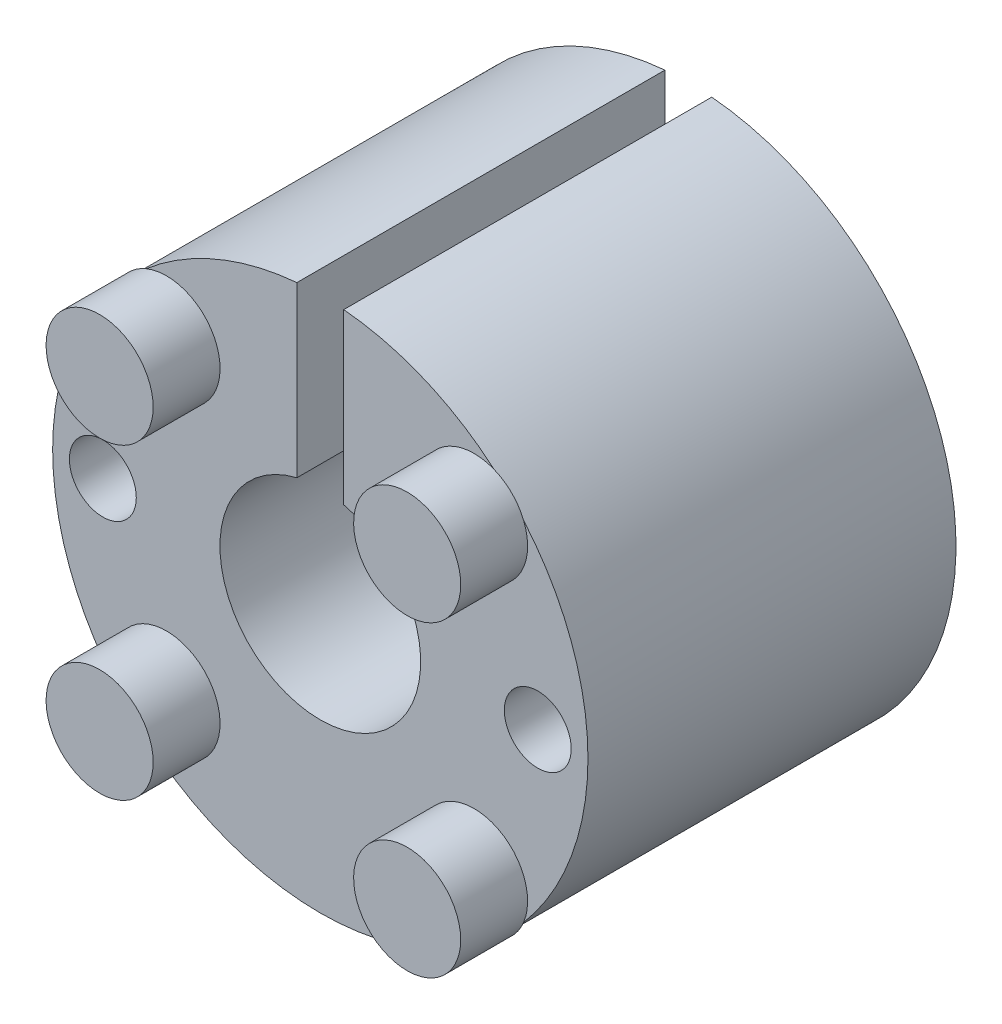
ISO-10303-21;
HEADER;
FILE_DESCRIPTION(('STEP AP214'),'2;1');
FILE_NAME('part.step','',(''),(''),'','','');
FILE_SCHEMA(('AUTOMOTIVE_DESIGN { 1 0 10303 214 1 1 1 1 }'));
ENDSEC;
DATA;
#1=APPLICATION_CONTEXT('core data for automotive mechanical design processes');
#2=APPLICATION_PROTOCOL_DEFINITION('international standard','automotive_design',2000,#1);
#3=PRODUCT_CONTEXT('',#1,'mechanical');
#4=PRODUCT('Part','Part','',(#3));
#5=PRODUCT_RELATED_PRODUCT_CATEGORY('part','',(#4));
#6=PRODUCT_DEFINITION_FORMATION('','',#4);
#7=PRODUCT_DEFINITION_CONTEXT('part definition',#1,'design');
#8=PRODUCT_DEFINITION('design','',#6,#7);
#9=PRODUCT_DEFINITION_SHAPE('','',#8);
#10=(LENGTH_UNIT() NAMED_UNIT(*) SI_UNIT(.MILLI.,.METRE.));
#11=(NAMED_UNIT(*) PLANE_ANGLE_UNIT() SI_UNIT($,.RADIAN.));
#12=(NAMED_UNIT(*) SI_UNIT($,.STERADIAN.) SOLID_ANGLE_UNIT());
#13=UNCERTAINTY_MEASURE_WITH_UNIT(LENGTH_MEASURE(1.E-05),#10,'distance_accuracy_value','');
#14=(GEOMETRIC_REPRESENTATION_CONTEXT(3) GLOBAL_UNCERTAINTY_ASSIGNED_CONTEXT((#13)) GLOBAL_UNIT_ASSIGNED_CONTEXT((#10,
#11,#12)) REPRESENTATION_CONTEXT('',''));
#15=CARTESIAN_POINT('',(0.,0.,0.));
#16=DIRECTION('',(0.,0.,1.));
#17=DIRECTION('',(1.,0.,0.));
#18=AXIS2_PLACEMENT_3D('',#15,#16,#17);
#19=CARTESIAN_POINT('',(0.,0.,11.));
#20=DIRECTION('',(0.,0.,1.));
#21=DIRECTION('',(1.,0.,0.));
#22=AXIS2_PLACEMENT_3D('',#19,#20,#21);
#23=PLANE('',#22);
#24=CARTESIAN_POINT('',(0.,0.,11.));
#25=DIRECTION('',(0.,0.,1.));
#26=DIRECTION('',(1.,0.,0.));
#27=AXIS2_PLACEMENT_3D('',#24,#25,#26);
#28=CIRCLE('',#27,8.);
#29=CARTESIAN_POINT('',(-0.700000000000001,7.96931615635871,11.));
#30=VERTEX_POINT('',#29);
#31=CARTESIAN_POINT('',(-5.20354670115188,6.07643824365322,11.));
#32=VERTEX_POINT('',#31);
#33=EDGE_CURVE('E111',#30,#32,#28,.T.);
#34=ORIENTED_EDGE('',*,*,#33,.T.);
#35=CARTESIAN_POINT('',(-4.59619407771257,4.59619407771255,11.));
#36=DIRECTION('',(0.,0.,1.));
#37=DIRECTION('',(1.,0.,0.));
#38=AXIS2_PLACEMENT_3D('',#35,#36,#37);
#39=CIRCLE('',#38,1.6);
#40=CARTESIAN_POINT('',(-6.07643824365324,5.20354670115186,11.));
#41=VERTEX_POINT('',#40);
#42=EDGE_CURVE('E113',#41,#32,#39,.T.);
#43=ORIENTED_EDGE('',*,*,#42,.F.);
#44=CARTESIAN_POINT('',(-6.07643824365322,-5.20354670115188,11.));
#45=VERTEX_POINT('',#44);
#46=EDGE_CURVE('E65',#41,#45,#28,.T.);
#47=ORIENTED_EDGE('',*,*,#46,.T.);
#48=CARTESIAN_POINT('',(-4.59619407771255,-4.59619407771257,11.));
#49=DIRECTION('',(0.,0.,1.));
#50=DIRECTION('',(1.,0.,0.));
#51=AXIS2_PLACEMENT_3D('',#48,#49,#50);
#52=CIRCLE('',#51,1.6);
#53=CARTESIAN_POINT('',(-5.20354670115186,-6.07643824365324,11.));
#54=VERTEX_POINT('',#53);
#55=EDGE_CURVE('E127',#54,#45,#52,.T.);
#56=ORIENTED_EDGE('',*,*,#55,.F.);
#57=CARTESIAN_POINT('',(5.20354670115188,-6.07643824365321,11.));
#58=VERTEX_POINT('',#57);
#59=EDGE_CURVE('E123',#54,#58,#28,.T.);
#60=ORIENTED_EDGE('',*,*,#59,.T.);
#61=CARTESIAN_POINT('',(4.59619407771257,-4.59619407771255,11.));
#62=DIRECTION('',(0.,0.,1.));
#63=DIRECTION('',(1.,0.,0.));
#64=AXIS2_PLACEMENT_3D('',#61,#62,#63);
#65=CIRCLE('',#64,1.6);
#66=CARTESIAN_POINT('',(6.07643824365324,-5.20354670115186,11.));
#67=VERTEX_POINT('',#66);
#68=EDGE_CURVE('E133',#67,#58,#65,.T.);
#69=ORIENTED_EDGE('',*,*,#68,.F.);
#70=CARTESIAN_POINT('',(6.07643824365321,5.2035467011519,11.));
#71=VERTEX_POINT('',#70);
#72=EDGE_CURVE('E208',#67,#71,#28,.T.);
#73=ORIENTED_EDGE('',*,*,#72,.T.);
#74=CARTESIAN_POINT('',(4.59619407771255,4.59619407771257,11.));
#75=DIRECTION('',(0.,0.,1.));
#76=DIRECTION('',(1.,0.,0.));
#77=AXIS2_PLACEMENT_3D('',#74,#75,#76);
#78=CIRCLE('',#77,1.6);
#79=CARTESIAN_POINT('',(5.20354670115188,6.07643824365322,11.));
#80=VERTEX_POINT('',#79);
#81=EDGE_CURVE('E11',#80,#71,#78,.T.);
#82=ORIENTED_EDGE('',*,*,#81,.F.);
#83=CARTESIAN_POINT('',(0.699999999999999,7.96931615635871,11.));
#84=VERTEX_POINT('',#83);
#85=EDGE_CURVE('E186',#80,#84,#28,.T.);
#86=ORIENTED_EDGE('',*,*,#85,.T.);
#87=DIRECTION('',(0.,1.,0.));
#88=VECTOR('',#87,1.);
#89=CARTESIAN_POINT('',(0.699999999999999,9.54270747111453,11.));
#90=LINE('',#89,#88);
#91=CARTESIAN_POINT('',(0.7,2.91719042916296,11.));
#92=VERTEX_POINT('',#91);
#93=EDGE_CURVE('E161',#92,#84,#90,.T.);
#94=ORIENTED_EDGE('',*,*,#93,.F.);
#95=CARTESIAN_POINT('',(0.,0.,11.));
#96=DIRECTION('',(0.,0.,1.));
#97=DIRECTION('',(1.,0.,0.));
#98=AXIS2_PLACEMENT_3D('',#95,#96,#97);
#99=CIRCLE('',#98,3.);
#100=CARTESIAN_POINT('',(-0.7,2.91719042916296,11.));
#101=VERTEX_POINT('',#100);
#102=EDGE_CURVE('E177',#101,#92,#99,.T.);
#103=ORIENTED_EDGE('',*,*,#102,.F.);
#104=DIRECTION('',(0.,-1.,0.));
#105=VECTOR('',#104,1.);
#106=CARTESIAN_POINT('',(-0.700000000000001,9.54270747111453,11.));
#107=LINE('',#106,#105);
#108=EDGE_CURVE('E151',#30,#101,#107,.T.);
#109=ORIENTED_EDGE('',*,*,#108,.F.);
#110=EDGE_LOOP('',(#34,#43,#47,#56,#60,#69,#73,#82,#86,#94,#103,#109));
#111=FACE_BOUND('',#110,.T.);
#112=CARTESIAN_POINT('',(6.5,0.,11.));
#113=DIRECTION('',(0.,0.,1.));
#114=DIRECTION('',(1.,0.,0.));
#115=AXIS2_PLACEMENT_3D('',#112,#113,#114);
#116=CIRCLE('',#115,1.);
#117=CARTESIAN_POINT('',(7.5,0.,11.));
#118=VERTEX_POINT('',#117);
#119=EDGE_CURVE('E152',#118,#118,#116,.T.);
#120=ORIENTED_EDGE('',*,*,#119,.F.);
#121=EDGE_LOOP('',(#120));
#122=FACE_BOUND('',#121,.T.);
#123=CARTESIAN_POINT('',(-6.5,0.,11.));
#124=DIRECTION('',(0.,0.,1.));
#125=DIRECTION('',(1.,0.,0.));
#126=AXIS2_PLACEMENT_3D('',#123,#124,#125);
#127=CIRCLE('',#126,1.);
#128=CARTESIAN_POINT('',(-5.5,0.,11.));
#129=VERTEX_POINT('',#128);
#130=EDGE_CURVE('E145',#129,#129,#127,.T.);
#131=ORIENTED_EDGE('',*,*,#130,.F.);
#132=EDGE_LOOP('',(#131));
#133=FACE_BOUND('',#132,.T.);
#134=ADVANCED_FACE('F41',(#111,#122,#133),#23,.T.);
#135=CARTESIAN_POINT('',(0.,0.,0.));
#136=DIRECTION('',(0.,0.,1.));
#137=DIRECTION('',(1.,0.,0.));
#138=AXIS2_PLACEMENT_3D('',#135,#136,#137);
#139=PLANE('',#138);
#140=CARTESIAN_POINT('',(0.,0.,0.));
#141=DIRECTION('',(0.,0.,1.));
#142=DIRECTION('',(1.,0.,0.));
#143=AXIS2_PLACEMENT_3D('',#140,#141,#142);
#144=CIRCLE('',#143,8.);
#145=CARTESIAN_POINT('',(-0.700000000000001,7.96931615635871,0.));
#146=VERTEX_POINT('',#145);
#147=CARTESIAN_POINT('',(0.699999999999999,7.96931615635871,0.));
#148=VERTEX_POINT('',#147);
#149=EDGE_CURVE('E180',#146,#148,#144,.T.);
#150=ORIENTED_EDGE('',*,*,#149,.F.);
#151=DIRECTION('',(0.,-1.,0.));
#152=VECTOR('',#151,1.);
#153=CARTESIAN_POINT('',(-0.7,0.,0.));
#154=LINE('',#153,#152);
#155=CARTESIAN_POINT('',(-0.7,2.91719042916296,0.));
#156=VERTEX_POINT('',#155);
#157=EDGE_CURVE('E170',#146,#156,#154,.T.);
#158=ORIENTED_EDGE('',*,*,#157,.T.);
#159=CARTESIAN_POINT('',(0.,0.,0.));
#160=DIRECTION('',(0.,0.,1.));
#161=DIRECTION('',(1.,0.,0.));
#162=AXIS2_PLACEMENT_3D('',#159,#160,#161);
#163=CIRCLE('',#162,3.);
#164=CARTESIAN_POINT('',(0.7,2.91719042916296,0.));
#165=VERTEX_POINT('',#164);
#166=EDGE_CURVE('E176',#156,#165,#163,.T.);
#167=ORIENTED_EDGE('',*,*,#166,.T.);
#168=DIRECTION('',(0.,1.,0.));
#169=VECTOR('',#168,1.);
#170=CARTESIAN_POINT('',(0.7,0.,0.));
#171=LINE('',#170,#169);
#172=EDGE_CURVE('E164',#165,#148,#171,.T.);
#173=ORIENTED_EDGE('',*,*,#172,.T.);
#174=EDGE_LOOP('',(#150,#158,#167,#173));
#175=FACE_BOUND('',#174,.T.);
#176=ADVANCED_FACE('F198',(#175),#139,.F.);
#177=CARTESIAN_POINT('',(0.,0.,11.));
#178=DIRECTION('',(0.,0.,-1.));
#179=DIRECTION('',(-1.,0.,0.));
#180=AXIS2_PLACEMENT_3D('',#177,#178,#179);
#181=CYLINDRICAL_SURFACE('',#180,8.);
#182=ORIENTED_EDGE('',*,*,#33,.F.);
#183=DIRECTION('',(0.,0.,-1.));
#184=VECTOR('',#183,1.);
#185=CARTESIAN_POINT('',(-0.700000000000001,7.96931615635871,11.));
#186=LINE('',#185,#184);
#187=EDGE_CURVE('E173',#30,#146,#186,.T.);
#188=ORIENTED_EDGE('',*,*,#187,.T.);
#189=ORIENTED_EDGE('',*,*,#149,.T.);
#190=DIRECTION('',(0.,0.,-1.));
#191=VECTOR('',#190,1.);
#192=CARTESIAN_POINT('',(0.699999999999999,7.96931615635871,11.));
#193=LINE('',#192,#191);
#194=EDGE_CURVE('E167',#148,#84,#193,.F.);
#195=ORIENTED_EDGE('',*,*,#194,.T.);
#196=ORIENTED_EDGE('',*,*,#85,.F.);
#197=EDGE_CURVE('E184',#71,#80,#28,.T.);
#198=ORIENTED_EDGE('',*,*,#197,.F.);
#199=ORIENTED_EDGE('',*,*,#72,.F.);
#200=EDGE_CURVE('E204',#58,#67,#28,.T.);
#201=ORIENTED_EDGE('',*,*,#200,.F.);
#202=ORIENTED_EDGE('',*,*,#59,.F.);
#203=EDGE_CURVE('E108',#45,#54,#28,.T.);
#204=ORIENTED_EDGE('',*,*,#203,.F.);
#205=ORIENTED_EDGE('',*,*,#46,.F.);
#206=EDGE_CURVE('E58',#32,#41,#28,.T.);
#207=ORIENTED_EDGE('',*,*,#206,.F.);
#208=EDGE_LOOP('',(#182,#188,#189,#195,#196,#198,#199,#201,#202,#204,#205,#207));
#209=FACE_BOUND('',#208,.T.);
#210=ADVANCED_FACE('F43',(#209),#181,.T.);
#211=CARTESIAN_POINT('',(0.,0.,11.));
#212=DIRECTION('',(0.,0.,-1.));
#213=DIRECTION('',(-1.,0.,0.));
#214=AXIS2_PLACEMENT_3D('',#211,#212,#213);
#215=CYLINDRICAL_SURFACE('',#214,3.);
#216=DIRECTION('',(0.,0.,-1.));
#217=VECTOR('',#216,1.);
#218=CARTESIAN_POINT('',(-0.7,2.91719042916296,11.));
#219=LINE('',#218,#217);
#220=EDGE_CURVE('E45',#101,#156,#219,.T.);
#221=ORIENTED_EDGE('',*,*,#220,.F.);
#222=ORIENTED_EDGE('',*,*,#102,.T.);
#223=DIRECTION('',(0.,0.,-1.));
#224=VECTOR('',#223,1.);
#225=CARTESIAN_POINT('',(0.7,2.91719042916296,11.));
#226=LINE('',#225,#224);
#227=EDGE_CURVE('E183',#165,#92,#226,.F.);
#228=ORIENTED_EDGE('',*,*,#227,.F.);
#229=ORIENTED_EDGE('',*,*,#166,.F.);
#230=EDGE_LOOP('',(#221,#222,#228,#229));
#231=FACE_BOUND('',#230,.T.);
#232=ADVANCED_FACE('F199',(#231),#215,.F.);
#233=CARTESIAN_POINT('',(0.699999999999999,9.54270747111453,-2.5));
#234=DIRECTION('',(1.,0.,0.));
#235=DIRECTION('',(0.,1.,0.));
#236=AXIS2_PLACEMENT_3D('',#233,#234,#235);
#237=PLANE('',#236);
#238=ORIENTED_EDGE('',*,*,#172,.F.);
#239=ORIENTED_EDGE('',*,*,#227,.T.);
#240=ORIENTED_EDGE('',*,*,#93,.T.);
#241=ORIENTED_EDGE('',*,*,#194,.F.);
#242=EDGE_LOOP('',(#238,#239,#240,#241));
#243=FACE_BOUND('',#242,.T.);
#244=ADVANCED_FACE('F201',(#243),#237,.F.);
#245=CARTESIAN_POINT('',(-0.700000000000001,9.54270747111453,-2.5));
#246=DIRECTION('',(-1.,0.,0.));
#247=DIRECTION('',(0.,-1.,0.));
#248=AXIS2_PLACEMENT_3D('',#245,#246,#247);
#249=PLANE('',#248);
#250=ORIENTED_EDGE('',*,*,#108,.T.);
#251=ORIENTED_EDGE('',*,*,#220,.T.);
#252=ORIENTED_EDGE('',*,*,#157,.F.);
#253=ORIENTED_EDGE('',*,*,#187,.F.);
#254=EDGE_LOOP('',(#250,#251,#252,#253));
#255=FACE_BOUND('',#254,.T.);
#256=ADVANCED_FACE('F192',(#255),#249,.F.);
#257=CARTESIAN_POINT('',(-6.5,0.,7.5));
#258=DIRECTION('',(0.,0.,1.));
#259=DIRECTION('',(1.,0.,0.));
#260=AXIS2_PLACEMENT_3D('',#257,#258,#259);
#261=CYLINDRICAL_SURFACE('',#260,1.);
#262=CARTESIAN_POINT('',(-6.5,0.,7.5));
#263=DIRECTION('',(0.,0.,1.));
#264=DIRECTION('',(1.,0.,0.));
#265=AXIS2_PLACEMENT_3D('',#262,#263,#264);
#266=CIRCLE('',#265,1.);
#267=CARTESIAN_POINT('',(-5.5,0.,7.5));
#268=VERTEX_POINT('',#267);
#269=EDGE_CURVE('E155',#268,#268,#266,.T.);
#270=CARTESIAN_POINT('',(-5.5,0.,7.5));
#271=CARTESIAN_POINT('',(-5.5,0.,7.53645833333333));
#272=CARTESIAN_POINT('',(-5.5,0.,7.57291666666667));
#273=CARTESIAN_POINT('',(-5.5,0.,7.64583333333333));
#274=CARTESIAN_POINT('',(-5.5,0.,7.68229166666667));
#275=CARTESIAN_POINT('',(-5.5,0.,7.75520833333333));
#276=CARTESIAN_POINT('',(-5.5,0.,7.79166666666667));
#277=CARTESIAN_POINT('',(-5.5,0.,7.86458333333333));
#278=CARTESIAN_POINT('',(-5.5,0.,7.90104166666667));
#279=CARTESIAN_POINT('',(-5.5,0.,7.97395833333333));
#280=CARTESIAN_POINT('',(-5.5,0.,8.01041666666667));
#281=CARTESIAN_POINT('',(-5.5,0.,8.08333333333333));
#282=CARTESIAN_POINT('',(-5.5,0.,8.11979166666667));
#283=CARTESIAN_POINT('',(-5.5,0.,8.19270833333333));
#284=CARTESIAN_POINT('',(-5.5,0.,8.22916666666667));
#285=CARTESIAN_POINT('',(-5.5,0.,8.30208333333333));
#286=CARTESIAN_POINT('',(-5.5,0.,8.33854166666667));
#287=CARTESIAN_POINT('',(-5.5,0.,8.41145833333333));
#288=CARTESIAN_POINT('',(-5.5,0.,8.44791666666667));
#289=CARTESIAN_POINT('',(-5.5,0.,8.52083333333333));
#290=CARTESIAN_POINT('',(-5.5,0.,8.55729166666667));
#291=CARTESIAN_POINT('',(-5.5,0.,8.63020833333333));
#292=CARTESIAN_POINT('',(-5.5,0.,8.66666666666667));
#293=CARTESIAN_POINT('',(-5.5,0.,8.73958333333333));
#294=CARTESIAN_POINT('',(-5.5,0.,8.77604166666667));
#295=CARTESIAN_POINT('',(-5.5,0.,8.84895833333333));
#296=CARTESIAN_POINT('',(-5.5,0.,8.88541666666667));
#297=CARTESIAN_POINT('',(-5.5,0.,8.95833333333333));
#298=CARTESIAN_POINT('',(-5.5,0.,8.99479166666667));
#299=CARTESIAN_POINT('',(-5.5,0.,9.06770833333333));
#300=CARTESIAN_POINT('',(-5.5,0.,9.10416666666667));
#301=CARTESIAN_POINT('',(-5.5,0.,9.17708333333333));
#302=CARTESIAN_POINT('',(-5.5,0.,9.21354166666666));
#303=CARTESIAN_POINT('',(-5.5,0.,9.28645833333333));
#304=CARTESIAN_POINT('',(-5.5,0.,9.32291666666666));
#305=CARTESIAN_POINT('',(-5.5,0.,9.39583333333333));
#306=CARTESIAN_POINT('',(-5.5,0.,9.43229166666667));
#307=CARTESIAN_POINT('',(-5.5,0.,9.50520833333333));
#308=CARTESIAN_POINT('',(-5.5,0.,9.54166666666667));
#309=CARTESIAN_POINT('',(-5.5,0.,9.61458333333333));
#310=CARTESIAN_POINT('',(-5.5,0.,9.65104166666667));
#311=CARTESIAN_POINT('',(-5.5,0.,9.72395833333333));
#312=CARTESIAN_POINT('',(-5.5,0.,9.76041666666667));
#313=CARTESIAN_POINT('',(-5.5,0.,9.83333333333333));
#314=CARTESIAN_POINT('',(-5.5,0.,9.86979166666667));
#315=CARTESIAN_POINT('',(-5.5,0.,9.94270833333333));
#316=CARTESIAN_POINT('',(-5.5,0.,9.97916666666667));
#317=CARTESIAN_POINT('',(-5.5,0.,10.0520833333333));
#318=CARTESIAN_POINT('',(-5.5,0.,10.0885416666667));
#319=CARTESIAN_POINT('',(-5.5,0.,10.1614583333333));
#320=CARTESIAN_POINT('',(-5.5,0.,10.1979166666667));
#321=CARTESIAN_POINT('',(-5.5,0.,10.2708333333333));
#322=CARTESIAN_POINT('',(-5.5,0.,10.3072916666667));
#323=CARTESIAN_POINT('',(-5.5,0.,10.3802083333333));
#324=CARTESIAN_POINT('',(-5.5,0.,10.4166666666667));
#325=CARTESIAN_POINT('',(-5.5,0.,10.4895833333333));
#326=CARTESIAN_POINT('',(-5.5,0.,10.5260416666667));
#327=CARTESIAN_POINT('',(-5.5,0.,10.5989583333333));
#328=CARTESIAN_POINT('',(-5.5,0.,10.6354166666667));
#329=CARTESIAN_POINT('',(-5.5,0.,10.7083333333333));
#330=CARTESIAN_POINT('',(-5.5,0.,10.7447916666667));
#331=CARTESIAN_POINT('',(-5.5,0.,10.8177083333333));
#332=CARTESIAN_POINT('',(-5.5,0.,10.8541666666667));
#333=CARTESIAN_POINT('',(-5.5,0.,10.9270833333333));
#334=CARTESIAN_POINT('',(-5.5,0.,10.9635416666667));
#335=CARTESIAN_POINT('',(-5.5,0.,11.));
#336=B_SPLINE_CURVE_WITH_KNOTS('',3,(#270,#271,#272,#273,#274,#275,#276,#277,#278,#279,#280,
#281,#282,#283,#284,#285,#286,#287,#288,#289,#290,#291,#292,#293,#294,#295,#296,#297,#298,#299,
#300,#301,#302,#303,#304,#305,#306,#307,#308,#309,#310,#311,#312,#313,#314,#315,#316,#317,#318,
#319,#320,#321,#322,#323,#324,#325,#326,#327,#328,#329,#330,#331,#332,#333,#334,#335),
.UNSPECIFIED.,.F.,.F.,(4,2,2,2,2,2,2,2,2,2,2,2,2,2,2,2,2,2,2,2,2,2,2,2,2,2,2,2,2,2,2,2,4),(0.,
0.109374999999999,0.218749999999999,0.328124999999999,0.437499999999999,0.546874999999999,
0.656249999999999,0.765624999999999,0.874999999999999,0.984374999999999,1.09375,1.203125,1.3125,
1.421875,1.53125,1.640625,1.75,1.859375,1.96875,2.078125,2.1875,2.296875,2.40625,2.515625,2.625,
2.734375,2.84375,2.953125,3.0625,3.171875,3.28125,3.390625,3.5),.UNSPECIFIED.);
#337=EDGE_CURVE('BSEAM248',#268,#129,#336,.T.);
#338=ORIENTED_EDGE('',*,*,#269,.F.);
#339=ORIENTED_EDGE('',*,*,#130,.T.);
#340=ORIENTED_EDGE('',*,*,#337,.T.);
#341=ORIENTED_EDGE('',*,*,#337,.F.);
#342=EDGE_LOOP('',(#338,#340,#339,#341));
#343=FACE_BOUND('',#342,.T.);
#344=ADVANCED_FACE('F248',(#343),#261,.F.);
#345=CARTESIAN_POINT('',(-6.5,0.,7.5));
#346=DIRECTION('',(0.,0.,1.));
#347=DIRECTION('',(1.,0.,0.));
#348=AXIS2_PLACEMENT_3D('',#345,#346,#347);
#349=PLANE('',#348);
#350=ORIENTED_EDGE('',*,*,#269,.T.);
#351=EDGE_LOOP('',(#350));
#352=FACE_BOUND('',#351,.T.);
#353=ADVANCED_FACE('F253',(#352),#349,.T.);
#354=CARTESIAN_POINT('',(6.5,0.,7.5));
#355=DIRECTION('',(0.,0.,1.));
#356=DIRECTION('',(1.,0.,0.));
#357=AXIS2_PLACEMENT_3D('',#354,#355,#356);
#358=CYLINDRICAL_SURFACE('',#357,1.);
#359=CARTESIAN_POINT('',(6.5,0.,7.5));
#360=DIRECTION('',(0.,0.,1.));
#361=DIRECTION('',(1.,0.,0.));
#362=AXIS2_PLACEMENT_3D('',#359,#360,#361);
#363=CIRCLE('',#362,1.);
#364=CARTESIAN_POINT('',(7.5,0.,7.5));
#365=VERTEX_POINT('',#364);
#366=EDGE_CURVE('E148',#365,#365,#363,.T.);
#367=CARTESIAN_POINT('',(7.5,0.,7.5));
#368=CARTESIAN_POINT('',(7.5,0.,7.53645833333333));
#369=CARTESIAN_POINT('',(7.5,0.,7.57291666666667));
#370=CARTESIAN_POINT('',(7.5,0.,7.64583333333333));
#371=CARTESIAN_POINT('',(7.5,0.,7.68229166666667));
#372=CARTESIAN_POINT('',(7.5,0.,7.75520833333333));
#373=CARTESIAN_POINT('',(7.5,0.,7.79166666666667));
#374=CARTESIAN_POINT('',(7.5,0.,7.86458333333333));
#375=CARTESIAN_POINT('',(7.5,0.,7.90104166666667));
#376=CARTESIAN_POINT('',(7.5,0.,7.97395833333333));
#377=CARTESIAN_POINT('',(7.5,0.,8.01041666666667));
#378=CARTESIAN_POINT('',(7.5,0.,8.08333333333333));
#379=CARTESIAN_POINT('',(7.5,0.,8.11979166666667));
#380=CARTESIAN_POINT('',(7.5,0.,8.19270833333333));
#381=CARTESIAN_POINT('',(7.5,0.,8.22916666666667));
#382=CARTESIAN_POINT('',(7.5,0.,8.30208333333333));
#383=CARTESIAN_POINT('',(7.5,0.,8.33854166666667));
#384=CARTESIAN_POINT('',(7.5,0.,8.41145833333333));
#385=CARTESIAN_POINT('',(7.5,0.,8.44791666666667));
#386=CARTESIAN_POINT('',(7.5,0.,8.52083333333333));
#387=CARTESIAN_POINT('',(7.5,0.,8.55729166666667));
#388=CARTESIAN_POINT('',(7.5,0.,8.63020833333333));
#389=CARTESIAN_POINT('',(7.5,0.,8.66666666666667));
#390=CARTESIAN_POINT('',(7.5,0.,8.73958333333333));
#391=CARTESIAN_POINT('',(7.5,0.,8.77604166666667));
#392=CARTESIAN_POINT('',(7.5,0.,8.84895833333333));
#393=CARTESIAN_POINT('',(7.5,0.,8.88541666666667));
#394=CARTESIAN_POINT('',(7.5,0.,8.95833333333333));
#395=CARTESIAN_POINT('',(7.5,0.,8.99479166666667));
#396=CARTESIAN_POINT('',(7.5,0.,9.06770833333333));
#397=CARTESIAN_POINT('',(7.5,0.,9.10416666666667));
#398=CARTESIAN_POINT('',(7.5,0.,9.17708333333333));
#399=CARTESIAN_POINT('',(7.5,0.,9.21354166666666));
#400=CARTESIAN_POINT('',(7.5,0.,9.28645833333333));
#401=CARTESIAN_POINT('',(7.5,0.,9.32291666666666));
#402=CARTESIAN_POINT('',(7.5,0.,9.39583333333333));
#403=CARTESIAN_POINT('',(7.5,0.,9.43229166666667));
#404=CARTESIAN_POINT('',(7.5,0.,9.50520833333333));
#405=CARTESIAN_POINT('',(7.5,0.,9.54166666666667));
#406=CARTESIAN_POINT('',(7.5,0.,9.61458333333333));
#407=CARTESIAN_POINT('',(7.5,0.,9.65104166666667));
#408=CARTESIAN_POINT('',(7.5,0.,9.72395833333333));
#409=CARTESIAN_POINT('',(7.5,0.,9.76041666666667));
#410=CARTESIAN_POINT('',(7.5,0.,9.83333333333333));
#411=CARTESIAN_POINT('',(7.5,0.,9.86979166666667));
#412=CARTESIAN_POINT('',(7.5,0.,9.94270833333333));
#413=CARTESIAN_POINT('',(7.5,0.,9.97916666666667));
#414=CARTESIAN_POINT('',(7.5,0.,10.0520833333333));
#415=CARTESIAN_POINT('',(7.5,0.,10.0885416666667));
#416=CARTESIAN_POINT('',(7.5,0.,10.1614583333333));
#417=CARTESIAN_POINT('',(7.5,0.,10.1979166666667));
#418=CARTESIAN_POINT('',(7.5,0.,10.2708333333333));
#419=CARTESIAN_POINT('',(7.5,0.,10.3072916666667));
#420=CARTESIAN_POINT('',(7.5,0.,10.3802083333333));
#421=CARTESIAN_POINT('',(7.5,0.,10.4166666666667));
#422=CARTESIAN_POINT('',(7.5,0.,10.4895833333333));
#423=CARTESIAN_POINT('',(7.5,0.,10.5260416666667));
#424=CARTESIAN_POINT('',(7.5,0.,10.5989583333333));
#425=CARTESIAN_POINT('',(7.5,0.,10.6354166666667));
#426=CARTESIAN_POINT('',(7.5,0.,10.7083333333333));
#427=CARTESIAN_POINT('',(7.5,0.,10.7447916666667));
#428=CARTESIAN_POINT('',(7.5,0.,10.8177083333333));
#429=CARTESIAN_POINT('',(7.5,0.,10.8541666666667));
#430=CARTESIAN_POINT('',(7.5,0.,10.9270833333333));
#431=CARTESIAN_POINT('',(7.5,0.,10.9635416666667));
#432=CARTESIAN_POINT('',(7.5,0.,11.));
#433=B_SPLINE_CURVE_WITH_KNOTS('',3,(#367,#368,#369,#370,#371,#372,#373,#374,#375,#376,#377,
#378,#379,#380,#381,#382,#383,#384,#385,#386,#387,#388,#389,#390,#391,#392,#393,#394,#395,#396,
#397,#398,#399,#400,#401,#402,#403,#404,#405,#406,#407,#408,#409,#410,#411,#412,#413,#414,#415,
#416,#417,#418,#419,#420,#421,#422,#423,#424,#425,#426,#427,#428,#429,#430,#431,#432),
.UNSPECIFIED.,.F.,.F.,(4,2,2,2,2,2,2,2,2,2,2,2,2,2,2,2,2,2,2,2,2,2,2,2,2,2,2,2,2,2,2,2,4),(0.,
0.109374999999999,0.218749999999999,0.328124999999999,0.437499999999999,0.546874999999999,
0.656249999999999,0.765624999999999,0.874999999999999,0.984374999999999,1.09375,1.203125,1.3125,
1.421875,1.53125,1.640625,1.75,1.859375,1.96875,2.078125,2.1875,2.296875,2.40625,2.515625,2.625,
2.734375,2.84375,2.953125,3.0625,3.171875,3.28125,3.390625,3.5),.UNSPECIFIED.);
#434=EDGE_CURVE('BSEAM257',#365,#118,#433,.T.);
#435=ORIENTED_EDGE('',*,*,#366,.F.);
#436=ORIENTED_EDGE('',*,*,#119,.T.);
#437=ORIENTED_EDGE('',*,*,#434,.T.);
#438=ORIENTED_EDGE('',*,*,#434,.F.);
#439=EDGE_LOOP('',(#435,#437,#436,#438));
#440=FACE_BOUND('',#439,.T.);
#441=ADVANCED_FACE('F257',(#440),#358,.F.);
#442=CARTESIAN_POINT('',(6.5,0.,7.5));
#443=DIRECTION('',(0.,0.,1.));
#444=DIRECTION('',(1.,0.,0.));
#445=AXIS2_PLACEMENT_3D('',#442,#443,#444);
#446=PLANE('',#445);
#447=ORIENTED_EDGE('',*,*,#366,.T.);
#448=EDGE_LOOP('',(#447));
#449=FACE_BOUND('',#448,.T.);
#450=ADVANCED_FACE('F261',(#449),#446,.T.);
#451=CARTESIAN_POINT('',(4.59619407771255,4.59619407771257,11.));
#452=DIRECTION('',(0.,0.,1.));
#453=DIRECTION('',(1.,0.,0.));
#454=AXIS2_PLACEMENT_3D('',#451,#452,#453);
#455=PLANE('',#454);
#456=EDGE_CURVE('E51',#71,#80,#78,.T.);
#457=ORIENTED_EDGE('',*,*,#456,.F.);
#458=ORIENTED_EDGE('',*,*,#197,.T.);
#459=EDGE_LOOP('',(#457,#458));
#460=FACE_BOUND('',#459,.T.);
#461=ADVANCED_FACE('F207',(#460),#455,.F.);
#462=CARTESIAN_POINT('',(4.59619407771255,4.59619407771257,13.));
#463=DIRECTION('',(0.,0.,-1.));
#464=DIRECTION('',(-1.,0.,0.));
#465=AXIS2_PLACEMENT_3D('',#462,#463,#464);
#466=CYLINDRICAL_SURFACE('',#465,1.6);
#467=CARTESIAN_POINT('',(4.59619407771255,4.59619407771257,13.));
#468=DIRECTION('',(0.,0.,1.));
#469=DIRECTION('',(1.,0.,0.));
#470=AXIS2_PLACEMENT_3D('',#467,#468,#469);
#471=CIRCLE('',#470,1.6);
#472=CARTESIAN_POINT('',(6.19619407771255,4.59619407771257,13.));
#473=VERTEX_POINT('',#472);
#474=EDGE_CURVE('E143',#473,#473,#471,.T.);
#475=ORIENTED_EDGE('',*,*,#474,.F.);
#476=EDGE_LOOP('',(#475));
#477=FACE_BOUND('',#476,.T.);
#478=ORIENTED_EDGE('',*,*,#456,.T.);
#479=ORIENTED_EDGE('',*,*,#81,.T.);
#480=EDGE_LOOP('',(#478,#479));
#481=FACE_BOUND('',#480,.T.);
#482=ADVANCED_FACE('F210',(#477,#481),#466,.T.);
#483=CARTESIAN_POINT('',(4.59619407771255,4.59619407771257,13.));
#484=DIRECTION('',(0.,0.,1.));
#485=DIRECTION('',(1.,0.,0.));
#486=AXIS2_PLACEMENT_3D('',#483,#484,#485);
#487=PLANE('',#486);
#488=ORIENTED_EDGE('',*,*,#474,.T.);
#489=EDGE_LOOP('',(#488));
#490=FACE_BOUND('',#489,.T.);
#491=ADVANCED_FACE('F267',(#490),#487,.T.);
#492=CARTESIAN_POINT('',(4.59619407771257,-4.59619407771255,13.));
#493=DIRECTION('',(0.,0.,-1.));
#494=DIRECTION('',(-1.,0.,0.));
#495=AXIS2_PLACEMENT_3D('',#492,#493,#494);
#496=CYLINDRICAL_SURFACE('',#495,1.6);
#497=CARTESIAN_POINT('',(4.59619407771257,-4.59619407771255,13.));
#498=DIRECTION('',(0.,0.,1.));
#499=DIRECTION('',(1.,0.,0.));
#500=AXIS2_PLACEMENT_3D('',#497,#498,#499);
#501=CIRCLE('',#500,1.6);
#502=CARTESIAN_POINT('',(6.19619407771257,-4.59619407771255,13.));
#503=VERTEX_POINT('',#502);
#504=EDGE_CURVE('E137',#503,#503,#501,.T.);
#505=ORIENTED_EDGE('',*,*,#504,.F.);
#506=EDGE_LOOP('',(#505));
#507=FACE_BOUND('',#506,.T.);
#508=EDGE_CURVE('E140',#58,#67,#65,.T.);
#509=ORIENTED_EDGE('',*,*,#508,.T.);
#510=ORIENTED_EDGE('',*,*,#68,.T.);
#511=EDGE_LOOP('',(#509,#510));
#512=FACE_BOUND('',#511,.T.);
#513=ADVANCED_FACE('F220',(#507,#512),#496,.T.);
#514=CARTESIAN_POINT('',(4.59619407771257,-4.59619407771255,13.));
#515=DIRECTION('',(0.,0.,1.));
#516=DIRECTION('',(1.,0.,0.));
#517=AXIS2_PLACEMENT_3D('',#514,#515,#516);
#518=PLANE('',#517);
#519=ORIENTED_EDGE('',*,*,#504,.T.);
#520=EDGE_LOOP('',(#519));
#521=FACE_BOUND('',#520,.T.);
#522=ADVANCED_FACE('F224',(#521),#518,.T.);
#523=CARTESIAN_POINT('',(4.59619407771257,-4.59619407771255,11.));
#524=DIRECTION('',(0.,0.,1.));
#525=DIRECTION('',(1.,0.,0.));
#526=AXIS2_PLACEMENT_3D('',#523,#524,#525);
#527=PLANE('',#526);
#528=ORIENTED_EDGE('',*,*,#508,.F.);
#529=ORIENTED_EDGE('',*,*,#200,.T.);
#530=EDGE_LOOP('',(#528,#529));
#531=FACE_BOUND('',#530,.T.);
#532=ADVANCED_FACE('F221',(#531),#527,.F.);
#533=CARTESIAN_POINT('',(-4.59619407771255,-4.59619407771257,13.));
#534=DIRECTION('',(0.,0.,-1.));
#535=DIRECTION('',(-1.,0.,0.));
#536=AXIS2_PLACEMENT_3D('',#533,#534,#535);
#537=CYLINDRICAL_SURFACE('',#536,1.6);
#538=CARTESIAN_POINT('',(-4.59619407771255,-4.59619407771257,13.));
#539=DIRECTION('',(0.,0.,1.));
#540=DIRECTION('',(1.,0.,0.));
#541=AXIS2_PLACEMENT_3D('',#538,#539,#540);
#542=CIRCLE('',#541,1.6);
#543=CARTESIAN_POINT('',(-2.99619407771255,-4.59619407771257,13.));
#544=VERTEX_POINT('',#543);
#545=EDGE_CURVE('E130',#544,#544,#542,.T.);
#546=ORIENTED_EDGE('',*,*,#545,.F.);
#547=EDGE_LOOP('',(#546));
#548=FACE_BOUND('',#547,.T.);
#549=EDGE_CURVE('E134',#45,#54,#52,.T.);
#550=ORIENTED_EDGE('',*,*,#549,.T.);
#551=ORIENTED_EDGE('',*,*,#55,.T.);
#552=EDGE_LOOP('',(#550,#551));
#553=FACE_BOUND('',#552,.T.);
#554=ADVANCED_FACE('F223',(#548,#553),#537,.T.);
#555=CARTESIAN_POINT('',(-4.59619407771255,-4.59619407771257,13.));
#556=DIRECTION('',(0.,0.,1.));
#557=DIRECTION('',(1.,0.,0.));
#558=AXIS2_PLACEMENT_3D('',#555,#556,#557);
#559=PLANE('',#558);
#560=ORIENTED_EDGE('',*,*,#545,.T.);
#561=EDGE_LOOP('',(#560));
#562=FACE_BOUND('',#561,.T.);
#563=ADVANCED_FACE('F230',(#562),#559,.T.);
#564=CARTESIAN_POINT('',(-4.59619407771255,-4.59619407771257,11.));
#565=DIRECTION('',(0.,0.,1.));
#566=DIRECTION('',(1.,0.,0.));
#567=AXIS2_PLACEMENT_3D('',#564,#565,#566);
#568=PLANE('',#567);
#569=ORIENTED_EDGE('',*,*,#549,.F.);
#570=ORIENTED_EDGE('',*,*,#203,.T.);
#571=EDGE_LOOP('',(#569,#570));
#572=FACE_BOUND('',#571,.T.);
#573=ADVANCED_FACE('F305',(#572),#568,.F.);
#574=CARTESIAN_POINT('',(-4.59619407771257,4.59619407771255,13.));
#575=DIRECTION('',(0.,0.,-1.));
#576=DIRECTION('',(-1.,0.,0.));
#577=AXIS2_PLACEMENT_3D('',#574,#575,#576);
#578=CYLINDRICAL_SURFACE('',#577,1.6);
#579=CARTESIAN_POINT('',(-4.59619407771257,4.59619407771255,13.));
#580=DIRECTION('',(0.,0.,1.));
#581=DIRECTION('',(1.,0.,0.));
#582=AXIS2_PLACEMENT_3D('',#579,#580,#581);
#583=CIRCLE('',#582,1.6);
#584=CARTESIAN_POINT('',(-2.99619407771257,4.59619407771255,13.));
#585=VERTEX_POINT('',#584);
#586=EDGE_CURVE('E125',#585,#585,#583,.T.);
#587=ORIENTED_EDGE('',*,*,#586,.F.);
#588=EDGE_LOOP('',(#587));
#589=FACE_BOUND('',#588,.T.);
#590=EDGE_CURVE('E119',#32,#41,#39,.T.);
#591=ORIENTED_EDGE('',*,*,#590,.T.);
#592=ORIENTED_EDGE('',*,*,#42,.T.);
#593=EDGE_LOOP('',(#591,#592));
#594=FACE_BOUND('',#593,.T.);
#595=ADVANCED_FACE('F124',(#589,#594),#578,.T.);
#596=CARTESIAN_POINT('',(-4.59619407771257,4.59619407771255,13.));
#597=DIRECTION('',(0.,0.,1.));
#598=DIRECTION('',(1.,0.,0.));
#599=AXIS2_PLACEMENT_3D('',#596,#597,#598);
#600=PLANE('',#599);
#601=ORIENTED_EDGE('',*,*,#586,.T.);
#602=EDGE_LOOP('',(#601));
#603=FACE_BOUND('',#602,.T.);
#604=ADVANCED_FACE('F323',(#603),#600,.T.);
#605=CARTESIAN_POINT('',(-4.59619407771257,4.59619407771255,11.));
#606=DIRECTION('',(0.,0.,1.));
#607=DIRECTION('',(1.,0.,0.));
#608=AXIS2_PLACEMENT_3D('',#605,#606,#607);
#609=PLANE('',#608);
#610=ORIENTED_EDGE('',*,*,#590,.F.);
#611=ORIENTED_EDGE('',*,*,#206,.T.);
#612=EDGE_LOOP('',(#610,#611));
#613=FACE_BOUND('',#612,.T.);
#614=ADVANCED_FACE('F122',(#613),#609,.F.);
#615=CLOSED_SHELL('',(#134,#176,#210,#232,#244,#256,#344,#353,#441,#450,#461,#482,#491,#513,
#522,#532,#554,#563,#573,#595,#604,#614));
#616=MANIFOLD_SOLID_BREP('B2',#615);
#617=ADVANCED_BREP_SHAPE_REPRESENTATION('',(#18,#616),#14);
#618=SHAPE_DEFINITION_REPRESENTATION(#9,#617);
ENDSEC;
END-ISO-10303-21;
